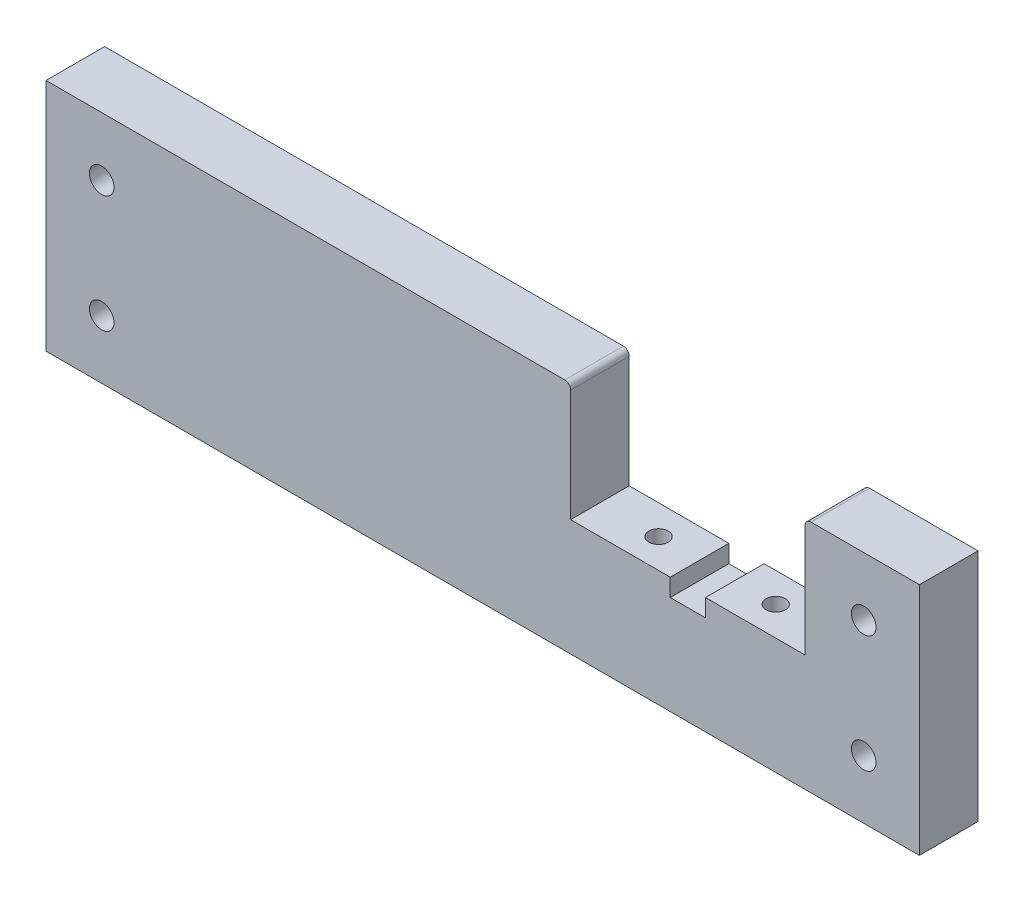
ISO-10303-21;
HEADER;
FILE_DESCRIPTION(('STEP AP214'),'2;1');
FILE_NAME('part.step','',(''),(''),'','','');
FILE_SCHEMA(('AUTOMOTIVE_DESIGN { 1 0 10303 214 1 1 1 1 }'));
ENDSEC;
DATA;
#1=APPLICATION_CONTEXT('core data for automotive mechanical design processes');
#2=APPLICATION_PROTOCOL_DEFINITION('international standard','automotive_design',2000,#1);
#3=PRODUCT_CONTEXT('',#1,'mechanical');
#4=PRODUCT('Part','Part','',(#3));
#5=PRODUCT_RELATED_PRODUCT_CATEGORY('part','',(#4));
#6=PRODUCT_DEFINITION_FORMATION('','',#4);
#7=PRODUCT_DEFINITION_CONTEXT('part definition',#1,'design');
#8=PRODUCT_DEFINITION('design','',#6,#7);
#9=PRODUCT_DEFINITION_SHAPE('','',#8);
#10=(LENGTH_UNIT() NAMED_UNIT(*) SI_UNIT(.MILLI.,.METRE.));
#11=(NAMED_UNIT(*) PLANE_ANGLE_UNIT() SI_UNIT($,.RADIAN.));
#12=(NAMED_UNIT(*) SI_UNIT($,.STERADIAN.) SOLID_ANGLE_UNIT());
#13=UNCERTAINTY_MEASURE_WITH_UNIT(LENGTH_MEASURE(1.E-05),#10,'distance_accuracy_value','');
#14=(GEOMETRIC_REPRESENTATION_CONTEXT(3) GLOBAL_UNCERTAINTY_ASSIGNED_CONTEXT((#13)) GLOBAL_UNIT_ASSIGNED_CONTEXT((#10,
#11,#12)) REPRESENTATION_CONTEXT('',''));
#15=CARTESIAN_POINT('',(0.,0.,0.));
#16=DIRECTION('',(0.,0.,1.));
#17=DIRECTION('',(1.,0.,0.));
#18=AXIS2_PLACEMENT_3D('',#15,#16,#17);
#19=CARTESIAN_POINT('',(55.,0.,-10.));
#20=DIRECTION('',(1.,0.,0.));
#21=DIRECTION('',(0.,0.,-1.));
#22=AXIS2_PLACEMENT_3D('',#19,#20,#21);
#23=PLANE('',#22);
#24=DIRECTION('',(0.,1.,0.));
#25=VECTOR('',#24,1.);
#26=CARTESIAN_POINT('',(55.,0.,0.));
#27=LINE('',#26,#25);
#28=CARTESIAN_POINT('',(55.,19.855,0.));
#29=VERTEX_POINT('',#28);
#30=CARTESIAN_POINT('',(55.,39.,0.));
#31=VERTEX_POINT('',#30);
#32=EDGE_CURVE('E239',#29,#31,#27,.T.);
#33=ORIENTED_EDGE('',*,*,#32,.T.);
#34=DIRECTION('',(0.,0.,1.));
#35=VECTOR('',#34,1.);
#36=CARTESIAN_POINT('',(55.,39.,-10.));
#37=LINE('',#36,#35);
#38=CARTESIAN_POINT('',(55.,39.,-10.));
#39=VERTEX_POINT('',#38);
#40=EDGE_CURVE('E363',#31,#39,#37,.F.);
#41=ORIENTED_EDGE('',*,*,#40,.T.);
#42=DIRECTION('',(0.,1.,0.));
#43=VECTOR('',#42,1.);
#44=CARTESIAN_POINT('',(55.,0.,-10.));
#45=LINE('',#44,#43);
#46=CARTESIAN_POINT('',(55.,19.855,-10.));
#47=VERTEX_POINT('',#46);
#48=EDGE_CURVE('E240',#47,#39,#45,.T.);
#49=ORIENTED_EDGE('',*,*,#48,.F.);
#50=DIRECTION('',(0.,0.,1.));
#51=VECTOR('',#50,1.);
#52=CARTESIAN_POINT('',(55.,19.855,-10.));
#53=LINE('',#52,#51);
#54=EDGE_CURVE('E350',#47,#29,#53,.T.);
#55=ORIENTED_EDGE('',*,*,#54,.T.);
#56=EDGE_LOOP('',(#33,#41,#49,#55));
#57=FACE_BOUND('',#56,.T.);
#58=ADVANCED_FACE('F42',(#57),#23,.F.);
#59=CARTESIAN_POINT('',(0.,40.,-10.));
#60=DIRECTION('',(0.,-1.,0.));
#61=DIRECTION('',(0.,0.,-1.));
#62=AXIS2_PLACEMENT_3D('',#59,#60,#61);
#63=PLANE('',#62);
#64=DIRECTION('',(1.,0.,0.));
#65=VECTOR('',#64,1.);
#66=CARTESIAN_POINT('',(0.,40.,-10.));
#67=LINE('',#66,#65);
#68=CARTESIAN_POINT('',(56.,40.,-10.));
#69=VERTEX_POINT('',#68);
#70=CARTESIAN_POINT('',(74.5,40.,-10.));
#71=VERTEX_POINT('',#70);
#72=EDGE_CURVE('E269',#69,#71,#67,.T.);
#73=ORIENTED_EDGE('',*,*,#72,.F.);
#74=DIRECTION('',(0.,0.,1.));
#75=VECTOR('',#74,1.);
#76=CARTESIAN_POINT('',(56.,40.,-10.));
#77=LINE('',#76,#75);
#78=CARTESIAN_POINT('',(56.,40.,0.));
#79=VERTEX_POINT('',#78);
#80=EDGE_CURVE('E324',#69,#79,#77,.T.);
#81=ORIENTED_EDGE('',*,*,#80,.T.);
#82=DIRECTION('',(1.,0.,0.));
#83=VECTOR('',#82,1.);
#84=CARTESIAN_POINT('',(0.,40.,0.));
#85=LINE('',#84,#83);
#86=CARTESIAN_POINT('',(74.5,40.,0.));
#87=VERTEX_POINT('',#86);
#88=EDGE_CURVE('E245',#79,#87,#85,.T.);
#89=ORIENTED_EDGE('',*,*,#88,.T.);
#90=DIRECTION('',(0.,0.,1.));
#91=VECTOR('',#90,1.);
#92=CARTESIAN_POINT('',(74.5,40.,-10.));
#93=LINE('',#92,#91);
#94=EDGE_CURVE('E320',#71,#87,#93,.T.);
#95=ORIENTED_EDGE('',*,*,#94,.F.);
#96=EDGE_LOOP('',(#73,#81,#89,#95));
#97=FACE_BOUND('',#96,.T.);
#98=ADVANCED_FACE('F416',(#97),#63,.F.);
#99=CARTESIAN_POINT('',(74.5,0.,-10.));
#100=DIRECTION('',(-1.,0.,0.));
#101=DIRECTION('',(0.,0.,1.));
#102=AXIS2_PLACEMENT_3D('',#99,#100,#101);
#103=PLANE('',#102);
#104=DIRECTION('',(0.,-1.,0.));
#105=VECTOR('',#104,1.);
#106=CARTESIAN_POINT('',(74.5,0.,0.));
#107=LINE('',#106,#105);
#108=CARTESIAN_POINT('',(74.5,0.,0.));
#109=VERTEX_POINT('',#108);
#110=EDGE_CURVE('E316',#87,#109,#107,.T.);
#111=ORIENTED_EDGE('',*,*,#110,.T.);
#112=DIRECTION('',(0.,0.,1.));
#113=VECTOR('',#112,1.);
#114=CARTESIAN_POINT('',(74.5,0.,-10.));
#115=LINE('',#114,#113);
#116=CARTESIAN_POINT('',(74.5,0.,-10.));
#117=VERTEX_POINT('',#116);
#118=EDGE_CURVE('E325',#117,#109,#115,.T.);
#119=ORIENTED_EDGE('',*,*,#118,.F.);
#120=DIRECTION('',(0.,-1.,0.));
#121=VECTOR('',#120,1.);
#122=CARTESIAN_POINT('',(74.5,0.,-10.));
#123=LINE('',#122,#121);
#124=EDGE_CURVE('E277',#71,#117,#123,.T.);
#125=ORIENTED_EDGE('',*,*,#124,.F.);
#126=ORIENTED_EDGE('',*,*,#94,.T.);
#127=EDGE_LOOP('',(#111,#119,#125,#126));
#128=FACE_BOUND('',#127,.T.);
#129=ADVANCED_FACE('F422',(#128),#103,.F.);
#130=CARTESIAN_POINT('',(0.,0.,-10.));
#131=DIRECTION('',(0.,-1.,0.));
#132=DIRECTION('',(1.,0.,0.));
#133=AXIS2_PLACEMENT_3D('',#130,#131,#132);
#134=PLANE('',#133);
#135=CARTESIAN_POINT('',(-60.,0.,-5.));
#136=DIRECTION('',(0.,-1.,0.));
#137=DIRECTION('',(0.,0.,-1.));
#138=AXIS2_PLACEMENT_3D('',#135,#136,#137);
#139=CIRCLE('',#138,2.09999999999999);
#140=CARTESIAN_POINT('',(-60.,0.,-7.09999999999999));
#141=VERTEX_POINT('',#140);
#142=EDGE_CURVE('E170',#141,#141,#139,.T.);
#143=ORIENTED_EDGE('',*,*,#142,.F.);
#144=EDGE_LOOP('',(#143));
#145=FACE_BOUND('',#144,.T.);
#146=CARTESIAN_POINT('',(0.,0.,-5.));
#147=DIRECTION('',(0.,-1.,0.));
#148=DIRECTION('',(0.,0.,-1.));
#149=AXIS2_PLACEMENT_3D('',#146,#147,#148);
#150=CIRCLE('',#149,2.09999999999999);
#151=CARTESIAN_POINT('',(0.,0.,-7.09999999999999));
#152=VERTEX_POINT('',#151);
#153=EDGE_CURVE('E169',#152,#152,#150,.T.);
#154=ORIENTED_EDGE('',*,*,#153,.F.);
#155=EDGE_LOOP('',(#154));
#156=FACE_BOUND('',#155,.T.);
#157=CARTESIAN_POINT('',(60.,0.,-5.));
#158=DIRECTION('',(0.,-1.,0.));
#159=DIRECTION('',(0.,0.,-1.));
#160=AXIS2_PLACEMENT_3D('',#157,#158,#159);
#161=CIRCLE('',#160,2.09999999999999);
#162=CARTESIAN_POINT('',(60.,0.,-7.09999999999999));
#163=VERTEX_POINT('',#162);
#164=EDGE_CURVE('E183',#163,#163,#161,.T.);
#165=ORIENTED_EDGE('',*,*,#164,.F.);
#166=EDGE_LOOP('',(#165));
#167=FACE_BOUND('',#166,.T.);
#168=DIRECTION('',(1.,0.,0.));
#169=VECTOR('',#168,1.);
#170=CARTESIAN_POINT('',(0.,0.,0.));
#171=LINE('',#170,#169);
#172=CARTESIAN_POINT('',(-74.5,0.,0.));
#173=VERTEX_POINT('',#172);
#174=EDGE_CURVE('E312',#173,#109,#171,.T.);
#175=ORIENTED_EDGE('',*,*,#174,.F.);
#176=DIRECTION('',(0.,0.,1.));
#177=VECTOR('',#176,1.);
#178=CARTESIAN_POINT('',(-74.5,0.,-10.));
#179=LINE('',#178,#177);
#180=CARTESIAN_POINT('',(-74.5,0.,-10.));
#181=VERTEX_POINT('',#180);
#182=EDGE_CURVE('E328',#181,#173,#179,.T.);
#183=ORIENTED_EDGE('',*,*,#182,.F.);
#184=DIRECTION('',(1.,0.,0.));
#185=VECTOR('',#184,1.);
#186=CARTESIAN_POINT('',(0.,0.,-10.));
#187=LINE('',#186,#185);
#188=EDGE_CURVE('E273',#181,#117,#187,.T.);
#189=ORIENTED_EDGE('',*,*,#188,.T.);
#190=ORIENTED_EDGE('',*,*,#118,.T.);
#191=EDGE_LOOP('',(#175,#183,#189,#190));
#192=FACE_BOUND('',#191,.T.);
#193=ADVANCED_FACE('F427',(#145,#156,#167,#192),#134,.T.);
#194=CARTESIAN_POINT('',(-74.5,0.,-10.));
#195=DIRECTION('',(-1.,0.,0.));
#196=DIRECTION('',(0.,0.,1.));
#197=AXIS2_PLACEMENT_3D('',#194,#195,#196);
#198=PLANE('',#197);
#199=DIRECTION('',(0.,-1.,0.));
#200=VECTOR('',#199,1.);
#201=CARTESIAN_POINT('',(-74.5,0.,0.));
#202=LINE('',#201,#200);
#203=CARTESIAN_POINT('',(-74.5,40.,0.));
#204=VERTEX_POINT('',#203);
#205=EDGE_CURVE('E308',#204,#173,#202,.T.);
#206=ORIENTED_EDGE('',*,*,#205,.F.);
#207=DIRECTION('',(0.,0.,1.));
#208=VECTOR('',#207,1.);
#209=CARTESIAN_POINT('',(-74.5,40.,-10.));
#210=LINE('',#209,#208);
#211=CARTESIAN_POINT('',(-74.5,40.,-10.));
#212=VERTEX_POINT('',#211);
#213=EDGE_CURVE('E331',#212,#204,#210,.T.);
#214=ORIENTED_EDGE('',*,*,#213,.F.);
#215=DIRECTION('',(0.,-1.,0.));
#216=VECTOR('',#215,1.);
#217=CARTESIAN_POINT('',(-74.5,0.,-10.));
#218=LINE('',#217,#216);
#219=EDGE_CURVE('E268',#212,#181,#218,.T.);
#220=ORIENTED_EDGE('',*,*,#219,.T.);
#221=ORIENTED_EDGE('',*,*,#182,.T.);
#222=EDGE_LOOP('',(#206,#214,#220,#221));
#223=FACE_BOUND('',#222,.T.);
#224=ADVANCED_FACE('F431',(#223),#198,.T.);
#225=CARTESIAN_POINT('',(14.,40.,0.));
#226=VERTEX_POINT('',#225);
#227=EDGE_CURVE('E305',#204,#226,#85,.T.);
#228=ORIENTED_EDGE('',*,*,#227,.T.);
#229=DIRECTION('',(0.,0.,1.));
#230=VECTOR('',#229,1.);
#231=CARTESIAN_POINT('',(14.,40.,-10.));
#232=LINE('',#231,#230);
#233=CARTESIAN_POINT('',(14.,40.,-10.));
#234=VERTEX_POINT('',#233);
#235=EDGE_CURVE('E11',#226,#234,#232,.F.);
#236=ORIENTED_EDGE('',*,*,#235,.T.);
#237=EDGE_CURVE('E265',#212,#234,#67,.T.);
#238=ORIENTED_EDGE('',*,*,#237,.F.);
#239=ORIENTED_EDGE('',*,*,#213,.T.);
#240=EDGE_LOOP('',(#228,#236,#238,#239));
#241=FACE_BOUND('',#240,.T.);
#242=ADVANCED_FACE('F432',(#241),#63,.F.);
#243=CARTESIAN_POINT('',(15.,0.,-10.));
#244=DIRECTION('',(1.,0.,0.));
#245=DIRECTION('',(0.,1.,0.));
#246=AXIS2_PLACEMENT_3D('',#243,#244,#245);
#247=PLANE('',#246);
#248=DIRECTION('',(0.,1.,0.));
#249=VECTOR('',#248,1.);
#250=CARTESIAN_POINT('',(15.,0.,-10.));
#251=LINE('',#250,#249);
#252=CARTESIAN_POINT('',(15.,19.855,-10.));
#253=VERTEX_POINT('',#252);
#254=CARTESIAN_POINT('',(15.,39.,-10.));
#255=VERTEX_POINT('',#254);
#256=EDGE_CURVE('E262',#253,#255,#251,.T.);
#257=ORIENTED_EDGE('',*,*,#256,.T.);
#258=DIRECTION('',(0.,0.,1.));
#259=VECTOR('',#258,1.);
#260=CARTESIAN_POINT('',(15.,39.,0.));
#261=LINE('',#260,#259);
#262=CARTESIAN_POINT('',(15.,39.,0.));
#263=VERTEX_POINT('',#262);
#264=EDGE_CURVE('E51',#255,#263,#261,.T.);
#265=ORIENTED_EDGE('',*,*,#264,.T.);
#266=DIRECTION('',(0.,1.,0.));
#267=VECTOR('',#266,1.);
#268=CARTESIAN_POINT('',(15.,0.,0.));
#269=LINE('',#268,#267);
#270=CARTESIAN_POINT('',(15.,19.855,0.));
#271=VERTEX_POINT('',#270);
#272=EDGE_CURVE('E301',#271,#263,#269,.T.);
#273=ORIENTED_EDGE('',*,*,#272,.F.);
#274=DIRECTION('',(0.,0.,1.));
#275=VECTOR('',#274,1.);
#276=CARTESIAN_POINT('',(15.,19.855,-10.));
#277=LINE('',#276,#275);
#278=EDGE_CURVE('E334',#253,#271,#277,.T.);
#279=ORIENTED_EDGE('',*,*,#278,.F.);
#280=EDGE_LOOP('',(#257,#265,#273,#279));
#281=FACE_BOUND('',#280,.T.);
#282=ADVANCED_FACE('F375',(#281),#247,.T.);
#283=CARTESIAN_POINT('',(0.,19.855,-10.));
#284=DIRECTION('',(0.,1.,0.));
#285=DIRECTION('',(-1.,0.,0.));
#286=AXIS2_PLACEMENT_3D('',#283,#284,#285);
#287=PLANE('',#286);
#288=CARTESIAN_POINT('',(25.,19.855,-5.));
#289=DIRECTION('',(0.,1.,0.));
#290=DIRECTION('',(0.,0.,1.));
#291=AXIS2_PLACEMENT_3D('',#288,#289,#290);
#292=CIRCLE('',#291,1.64999999999999);
#293=CARTESIAN_POINT('',(25.,19.855,-3.35000000000001));
#294=VERTEX_POINT('',#293);
#295=EDGE_CURVE('E223',#294,#294,#292,.T.);
#296=ORIENTED_EDGE('',*,*,#295,.F.);
#297=EDGE_LOOP('',(#296));
#298=FACE_BOUND('',#297,.T.);
#299=DIRECTION('',(-1.,0.,0.));
#300=VECTOR('',#299,1.);
#301=CARTESIAN_POINT('',(0.,19.855,0.));
#302=LINE('',#301,#300);
#303=CARTESIAN_POINT('',(31.995,19.855,0.));
#304=VERTEX_POINT('',#303);
#305=EDGE_CURVE('E297',#304,#271,#302,.T.);
#306=ORIENTED_EDGE('',*,*,#305,.F.);
#307=DIRECTION('',(0.,0.,1.));
#308=VECTOR('',#307,1.);
#309=CARTESIAN_POINT('',(31.995,19.855,-10.));
#310=LINE('',#309,#308);
#311=CARTESIAN_POINT('',(31.995,19.855,-10.));
#312=VERTEX_POINT('',#311);
#313=EDGE_CURVE('E337',#312,#304,#310,.T.);
#314=ORIENTED_EDGE('',*,*,#313,.F.);
#315=DIRECTION('',(-1.,0.,0.));
#316=VECTOR('',#315,1.);
#317=CARTESIAN_POINT('',(0.,19.855,-10.));
#318=LINE('',#317,#316);
#319=EDGE_CURVE('E258',#312,#253,#318,.T.);
#320=ORIENTED_EDGE('',*,*,#319,.T.);
#321=ORIENTED_EDGE('',*,*,#278,.T.);
#322=EDGE_LOOP('',(#306,#314,#320,#321));
#323=FACE_BOUND('',#322,.T.);
#324=ADVANCED_FACE('F385',(#298,#323),#287,.T.);
#325=CARTESIAN_POINT('',(31.995,0.,-10.));
#326=DIRECTION('',(-1.,0.,0.));
#327=DIRECTION('',(0.,0.,1.));
#328=AXIS2_PLACEMENT_3D('',#325,#326,#327);
#329=PLANE('',#328);
#330=DIRECTION('',(0.,-1.,0.));
#331=VECTOR('',#330,1.);
#332=CARTESIAN_POINT('',(31.995,0.,0.));
#333=LINE('',#332,#331);
#334=CARTESIAN_POINT('',(31.995,16.85,0.));
#335=VERTEX_POINT('',#334);
#336=EDGE_CURVE('E294',#304,#335,#333,.T.);
#337=ORIENTED_EDGE('',*,*,#336,.T.);
#338=DIRECTION('',(0.,0.,1.));
#339=VECTOR('',#338,1.);
#340=CARTESIAN_POINT('',(31.995,16.85,-10.));
#341=LINE('',#340,#339);
#342=CARTESIAN_POINT('',(31.995,16.85,-10.));
#343=VERTEX_POINT('',#342);
#344=EDGE_CURVE('E340',#343,#335,#341,.T.);
#345=ORIENTED_EDGE('',*,*,#344,.F.);
#346=DIRECTION('',(0.,-1.,0.));
#347=VECTOR('',#346,1.);
#348=CARTESIAN_POINT('',(31.995,0.,-10.));
#349=LINE('',#348,#347);
#350=EDGE_CURVE('E255',#312,#343,#349,.T.);
#351=ORIENTED_EDGE('',*,*,#350,.F.);
#352=ORIENTED_EDGE('',*,*,#313,.T.);
#353=EDGE_LOOP('',(#337,#345,#351,#352));
#354=FACE_BOUND('',#353,.T.);
#355=ADVANCED_FACE('F394',(#354),#329,.F.);
#356=CARTESIAN_POINT('',(0.,16.85,-10.));
#357=DIRECTION('',(0.,-1.,0.));
#358=DIRECTION('',(0.,0.,-1.));
#359=AXIS2_PLACEMENT_3D('',#356,#357,#358);
#360=PLANE('',#359);
#361=DIRECTION('',(1.,0.,0.));
#362=VECTOR('',#361,1.);
#363=CARTESIAN_POINT('',(0.,16.85,0.));
#364=LINE('',#363,#362);
#365=CARTESIAN_POINT('',(38.005,16.85,0.));
#366=VERTEX_POINT('',#365);
#367=EDGE_CURVE('E290',#335,#366,#364,.T.);
#368=ORIENTED_EDGE('',*,*,#367,.T.);
#369=DIRECTION('',(0.,0.,1.));
#370=VECTOR('',#369,1.);
#371=CARTESIAN_POINT('',(38.005,16.85,-10.));
#372=LINE('',#371,#370);
#373=CARTESIAN_POINT('',(38.005,16.85,-10.));
#374=VERTEX_POINT('',#373);
#375=EDGE_CURVE('E344',#374,#366,#372,.T.);
#376=ORIENTED_EDGE('',*,*,#375,.F.);
#377=DIRECTION('',(1.,0.,0.));
#378=VECTOR('',#377,1.);
#379=CARTESIAN_POINT('',(0.,16.85,-10.));
#380=LINE('',#379,#378);
#381=EDGE_CURVE('E252',#343,#374,#380,.T.);
#382=ORIENTED_EDGE('',*,*,#381,.F.);
#383=ORIENTED_EDGE('',*,*,#344,.T.);
#384=EDGE_LOOP('',(#368,#376,#382,#383));
#385=FACE_BOUND('',#384,.T.);
#386=ADVANCED_FACE('F396',(#385),#360,.F.);
#387=CARTESIAN_POINT('',(38.005,0.,-10.));
#388=DIRECTION('',(-1.,0.,0.));
#389=DIRECTION('',(0.,0.,1.));
#390=AXIS2_PLACEMENT_3D('',#387,#388,#389);
#391=PLANE('',#390);
#392=DIRECTION('',(0.,-1.,0.));
#393=VECTOR('',#392,1.);
#394=CARTESIAN_POINT('',(38.005,0.,0.));
#395=LINE('',#394,#393);
#396=CARTESIAN_POINT('',(38.005,19.855,0.));
#397=VERTEX_POINT('',#396);
#398=EDGE_CURVE('E286',#397,#366,#395,.T.);
#399=ORIENTED_EDGE('',*,*,#398,.F.);
#400=DIRECTION('',(0.,0.,1.));
#401=VECTOR('',#400,1.);
#402=CARTESIAN_POINT('',(38.005,19.855,-10.));
#403=LINE('',#402,#401);
#404=CARTESIAN_POINT('',(38.005,19.855,-10.));
#405=VERTEX_POINT('',#404);
#406=EDGE_CURVE('E347',#405,#397,#403,.T.);
#407=ORIENTED_EDGE('',*,*,#406,.F.);
#408=DIRECTION('',(0.,-1.,0.));
#409=VECTOR('',#408,1.);
#410=CARTESIAN_POINT('',(38.005,0.,-10.));
#411=LINE('',#410,#409);
#412=EDGE_CURVE('E248',#405,#374,#411,.T.);
#413=ORIENTED_EDGE('',*,*,#412,.T.);
#414=ORIENTED_EDGE('',*,*,#375,.T.);
#415=EDGE_LOOP('',(#399,#407,#413,#414));
#416=FACE_BOUND('',#415,.T.);
#417=ADVANCED_FACE('F399',(#416),#391,.T.);
#418=CARTESIAN_POINT('',(0.,19.855,-10.));
#419=DIRECTION('',(0.,-1.,0.));
#420=DIRECTION('',(1.,0.,0.));
#421=AXIS2_PLACEMENT_3D('',#418,#419,#420);
#422=PLANE('',#421);
#423=CARTESIAN_POINT('',(45.,19.855,-5.));
#424=DIRECTION('',(0.,1.,0.));
#425=DIRECTION('',(0.,0.,1.));
#426=AXIS2_PLACEMENT_3D('',#423,#424,#425);
#427=CIRCLE('',#426,1.64999999999999);
#428=CARTESIAN_POINT('',(45.,19.855,-3.35000000000001));
#429=VERTEX_POINT('',#428);
#430=EDGE_CURVE('E231',#429,#429,#427,.T.);
#431=ORIENTED_EDGE('',*,*,#430,.F.);
#432=EDGE_LOOP('',(#431));
#433=FACE_BOUND('',#432,.T.);
#434=DIRECTION('',(1.,0.,0.));
#435=VECTOR('',#434,1.);
#436=CARTESIAN_POINT('',(0.,19.855,0.));
#437=LINE('',#436,#435);
#438=EDGE_CURVE('E283',#397,#29,#437,.T.);
#439=ORIENTED_EDGE('',*,*,#438,.T.);
#440=ORIENTED_EDGE('',*,*,#54,.F.);
#441=DIRECTION('',(1.,0.,0.));
#442=VECTOR('',#441,1.);
#443=CARTESIAN_POINT('',(0.,19.855,-10.));
#444=LINE('',#443,#442);
#445=EDGE_CURVE('E244',#405,#47,#444,.T.);
#446=ORIENTED_EDGE('',*,*,#445,.F.);
#447=ORIENTED_EDGE('',*,*,#406,.T.);
#448=EDGE_LOOP('',(#439,#440,#446,#447));
#449=FACE_BOUND('',#448,.T.);
#450=ADVANCED_FACE('F405',(#433,#449),#422,.F.);
#451=CARTESIAN_POINT('',(0.,0.,-10.));
#452=DIRECTION('',(0.,0.,1.));
#453=DIRECTION('',(1.,0.,0.));
#454=AXIS2_PLACEMENT_3D('',#451,#452,#453);
#455=PLANE('',#454);
#456=CARTESIAN_POINT('',(-65.,30.,-10.));
#457=DIRECTION('',(0.,0.,1.));
#458=DIRECTION('',(1.,0.,0.));
#459=AXIS2_PLACEMENT_3D('',#456,#457,#458);
#460=CIRCLE('',#459,2.09999999999999);
#461=CARTESIAN_POINT('',(-62.9,30.,-10.));
#462=VERTEX_POINT('',#461);
#463=EDGE_CURVE('E195',#462,#462,#460,.T.);
#464=ORIENTED_EDGE('',*,*,#463,.T.);
#465=EDGE_LOOP('',(#464));
#466=FACE_BOUND('',#465,.T.);
#467=CARTESIAN_POINT('',(-65.,10.,-10.));
#468=DIRECTION('',(0.,0.,1.));
#469=DIRECTION('',(1.,0.,0.));
#470=AXIS2_PLACEMENT_3D('',#467,#468,#469);
#471=CIRCLE('',#470,2.09999999999999);
#472=CARTESIAN_POINT('',(-62.9,10.,-10.));
#473=VERTEX_POINT('',#472);
#474=EDGE_CURVE('E203',#473,#473,#471,.T.);
#475=ORIENTED_EDGE('',*,*,#474,.T.);
#476=EDGE_LOOP('',(#475));
#477=FACE_BOUND('',#476,.T.);
#478=CARTESIAN_POINT('',(65.,10.,-10.));
#479=DIRECTION('',(0.,0.,1.));
#480=DIRECTION('',(1.,0.,0.));
#481=AXIS2_PLACEMENT_3D('',#478,#479,#480);
#482=CIRCLE('',#481,2.09999999999999);
#483=CARTESIAN_POINT('',(67.1,10.,-10.));
#484=VERTEX_POINT('',#483);
#485=EDGE_CURVE('E211',#484,#484,#482,.T.);
#486=ORIENTED_EDGE('',*,*,#485,.T.);
#487=EDGE_LOOP('',(#486));
#488=FACE_BOUND('',#487,.T.);
#489=CARTESIAN_POINT('',(65.,30.,-10.));
#490=DIRECTION('',(0.,0.,1.));
#491=DIRECTION('',(1.,0.,0.));
#492=AXIS2_PLACEMENT_3D('',#489,#490,#491);
#493=CIRCLE('',#492,2.09999999999999);
#494=CARTESIAN_POINT('',(67.1,30.,-10.));
#495=VERTEX_POINT('',#494);
#496=EDGE_CURVE('E219',#495,#495,#493,.T.);
#497=ORIENTED_EDGE('',*,*,#496,.T.);
#498=EDGE_LOOP('',(#497));
#499=FACE_BOUND('',#498,.T.);
#500=ORIENTED_EDGE('',*,*,#48,.T.);
#501=CARTESIAN_POINT('',(56.,39.,-10.));
#502=DIRECTION('',(0.,0.,1.));
#503=DIRECTION('',(1.,0.,0.));
#504=AXIS2_PLACEMENT_3D('',#501,#502,#503);
#505=CIRCLE('',#504,1.);
#506=EDGE_CURVE('E368',#39,#69,#505,.F.);
#507=ORIENTED_EDGE('',*,*,#506,.T.);
#508=ORIENTED_EDGE('',*,*,#72,.T.);
#509=ORIENTED_EDGE('',*,*,#124,.T.);
#510=ORIENTED_EDGE('',*,*,#188,.F.);
#511=ORIENTED_EDGE('',*,*,#219,.F.);
#512=ORIENTED_EDGE('',*,*,#237,.T.);
#513=CARTESIAN_POINT('',(14.,39.,-10.));
#514=DIRECTION('',(0.,0.,1.));
#515=DIRECTION('',(1.,0.,0.));
#516=AXIS2_PLACEMENT_3D('',#513,#514,#515);
#517=CIRCLE('',#516,1.);
#518=EDGE_CURVE('E58',#234,#255,#517,.F.);
#519=ORIENTED_EDGE('',*,*,#518,.T.);
#520=ORIENTED_EDGE('',*,*,#256,.F.);
#521=ORIENTED_EDGE('',*,*,#319,.F.);
#522=ORIENTED_EDGE('',*,*,#350,.T.);
#523=ORIENTED_EDGE('',*,*,#381,.T.);
#524=ORIENTED_EDGE('',*,*,#412,.F.);
#525=ORIENTED_EDGE('',*,*,#445,.T.);
#526=EDGE_LOOP('',(#500,#507,#508,#509,#510,#511,#512,#519,#520,#521,#522,#523,#524,#525));
#527=FACE_BOUND('',#526,.T.);
#528=ADVANCED_FACE('F388',(#466,#477,#488,#499,#527),#455,.F.);
#529=CARTESIAN_POINT('',(0.,0.,0.));
#530=DIRECTION('',(0.,0.,1.));
#531=DIRECTION('',(1.,0.,0.));
#532=AXIS2_PLACEMENT_3D('',#529,#530,#531);
#533=PLANE('',#532);
#534=CARTESIAN_POINT('',(-65.,30.,0.));
#535=DIRECTION('',(0.,0.,1.));
#536=DIRECTION('',(1.,0.,0.));
#537=AXIS2_PLACEMENT_3D('',#534,#535,#536);
#538=CIRCLE('',#537,2.09999999999999);
#539=CARTESIAN_POINT('',(-62.9,30.,0.));
#540=VERTEX_POINT('',#539);
#541=EDGE_CURVE('E191',#540,#540,#538,.T.);
#542=ORIENTED_EDGE('',*,*,#541,.F.);
#543=EDGE_LOOP('',(#542));
#544=FACE_BOUND('',#543,.T.);
#545=CARTESIAN_POINT('',(-65.,10.,0.));
#546=DIRECTION('',(0.,0.,1.));
#547=DIRECTION('',(1.,0.,0.));
#548=AXIS2_PLACEMENT_3D('',#545,#546,#547);
#549=CIRCLE('',#548,2.09999999999999);
#550=CARTESIAN_POINT('',(-62.9,10.,0.));
#551=VERTEX_POINT('',#550);
#552=EDGE_CURVE('E199',#551,#551,#549,.T.);
#553=ORIENTED_EDGE('',*,*,#552,.F.);
#554=EDGE_LOOP('',(#553));
#555=FACE_BOUND('',#554,.T.);
#556=CARTESIAN_POINT('',(65.,10.,0.));
#557=DIRECTION('',(0.,0.,1.));
#558=DIRECTION('',(1.,0.,0.));
#559=AXIS2_PLACEMENT_3D('',#556,#557,#558);
#560=CIRCLE('',#559,2.09999999999999);
#561=CARTESIAN_POINT('',(67.1,10.,0.));
#562=VERTEX_POINT('',#561);
#563=EDGE_CURVE('E207',#562,#562,#560,.T.);
#564=ORIENTED_EDGE('',*,*,#563,.F.);
#565=EDGE_LOOP('',(#564));
#566=FACE_BOUND('',#565,.T.);
#567=CARTESIAN_POINT('',(65.,30.,0.));
#568=DIRECTION('',(0.,0.,1.));
#569=DIRECTION('',(1.,0.,0.));
#570=AXIS2_PLACEMENT_3D('',#567,#568,#569);
#571=CIRCLE('',#570,2.09999999999999);
#572=CARTESIAN_POINT('',(67.1,30.,0.));
#573=VERTEX_POINT('',#572);
#574=EDGE_CURVE('E215',#573,#573,#571,.T.);
#575=ORIENTED_EDGE('',*,*,#574,.F.);
#576=EDGE_LOOP('',(#575));
#577=FACE_BOUND('',#576,.T.);
#578=ORIENTED_EDGE('',*,*,#88,.F.);
#579=CARTESIAN_POINT('',(56.,39.,0.));
#580=DIRECTION('',(0.,0.,1.));
#581=DIRECTION('',(1.,0.,0.));
#582=AXIS2_PLACEMENT_3D('',#579,#580,#581);
#583=CIRCLE('',#582,1.);
#584=EDGE_CURVE('E360',#79,#31,#583,.T.);
#585=ORIENTED_EDGE('',*,*,#584,.T.);
#586=ORIENTED_EDGE('',*,*,#32,.F.);
#587=ORIENTED_EDGE('',*,*,#438,.F.);
#588=ORIENTED_EDGE('',*,*,#398,.T.);
#589=ORIENTED_EDGE('',*,*,#367,.F.);
#590=ORIENTED_EDGE('',*,*,#336,.F.);
#591=ORIENTED_EDGE('',*,*,#305,.T.);
#592=ORIENTED_EDGE('',*,*,#272,.T.);
#593=CARTESIAN_POINT('',(14.,39.,0.));
#594=DIRECTION('',(0.,0.,1.));
#595=DIRECTION('',(1.,0.,0.));
#596=AXIS2_PLACEMENT_3D('',#593,#594,#595);
#597=CIRCLE('',#596,1.);
#598=EDGE_CURVE('E357',#263,#226,#597,.T.);
#599=ORIENTED_EDGE('',*,*,#598,.T.);
#600=ORIENTED_EDGE('',*,*,#227,.F.);
#601=ORIENTED_EDGE('',*,*,#205,.T.);
#602=ORIENTED_EDGE('',*,*,#174,.T.);
#603=ORIENTED_EDGE('',*,*,#110,.F.);
#604=EDGE_LOOP('',(#578,#585,#586,#587,#588,#589,#590,#591,#592,#599,#600,#601,#602,#603));
#605=FACE_BOUND('',#604,.T.);
#606=ADVANCED_FACE('F379',(#544,#555,#566,#577,#605),#533,.T.);
#607=CARTESIAN_POINT('',(45.,14.855,-5.));
#608=DIRECTION('',(0.,1.,0.));
#609=DIRECTION('',(0.,0.,1.));
#610=AXIS2_PLACEMENT_3D('',#607,#608,#609);
#611=CONICAL_SURFACE('',#610,1.65,1.02974425867666);
#612=CARTESIAN_POINT('',(45.,13.8635799786045,-5.));
#613=VERTEX_POINT('',#612);
#614=VERTEX_LOOP('',#613);
#615=FACE_BOUND('',#614,.T.);
#616=CARTESIAN_POINT('',(45.,14.855,-5.));
#617=DIRECTION('',(0.,1.,0.));
#618=DIRECTION('',(0.,0.,1.));
#619=AXIS2_PLACEMENT_3D('',#616,#617,#618);
#620=CIRCLE('',#619,1.65);
#621=CARTESIAN_POINT('',(45.,14.855,-3.35));
#622=VERTEX_POINT('',#621);
#623=EDGE_CURVE('E235',#622,#622,#620,.T.);
#624=ORIENTED_EDGE('',*,*,#623,.T.);
#625=EDGE_LOOP('',(#624));
#626=FACE_BOUND('',#625,.T.);
#627=ADVANCED_FACE('F467',(#615,#626),#611,.F.);
#628=CARTESIAN_POINT('',(45.,19.855,-5.));
#629=DIRECTION('',(0.,1.,0.));
#630=DIRECTION('',(0.,0.,1.));
#631=AXIS2_PLACEMENT_3D('',#628,#629,#630);
#632=CYLINDRICAL_SURFACE('',#631,1.65);
#633=ORIENTED_EDGE('',*,*,#623,.F.);
#634=EDGE_LOOP('',(#633));
#635=FACE_BOUND('',#634,.T.);
#636=ORIENTED_EDGE('',*,*,#430,.T.);
#637=EDGE_LOOP('',(#636));
#638=FACE_BOUND('',#637,.T.);
#639=ADVANCED_FACE('F474',(#635,#638),#632,.F.);
#640=CARTESIAN_POINT('',(25.,14.855,-5.));
#641=DIRECTION('',(0.,1.,0.));
#642=DIRECTION('',(0.,0.,1.));
#643=AXIS2_PLACEMENT_3D('',#640,#641,#642);
#644=CONICAL_SURFACE('',#643,1.65,1.02974425867665);
#645=CARTESIAN_POINT('',(25.,13.8635799786045,-5.));
#646=VERTEX_POINT('',#645);
#647=VERTEX_LOOP('',#646);
#648=FACE_BOUND('',#647,.T.);
#649=CARTESIAN_POINT('',(25.,14.855,-5.));
#650=DIRECTION('',(0.,1.,0.));
#651=DIRECTION('',(0.,0.,1.));
#652=AXIS2_PLACEMENT_3D('',#649,#650,#651);
#653=CIRCLE('',#652,1.65);
#654=CARTESIAN_POINT('',(25.,14.855,-3.35));
#655=VERTEX_POINT('',#654);
#656=EDGE_CURVE('E227',#655,#655,#653,.T.);
#657=ORIENTED_EDGE('',*,*,#656,.T.);
#658=EDGE_LOOP('',(#657));
#659=FACE_BOUND('',#658,.T.);
#660=ADVANCED_FACE('F478',(#648,#659),#644,.F.);
#661=CARTESIAN_POINT('',(25.,19.855,-5.));
#662=DIRECTION('',(0.,1.,0.));
#663=DIRECTION('',(0.,0.,1.));
#664=AXIS2_PLACEMENT_3D('',#661,#662,#663);
#665=CYLINDRICAL_SURFACE('',#664,1.64999999999999);
#666=ORIENTED_EDGE('',*,*,#656,.F.);
#667=EDGE_LOOP('',(#666));
#668=FACE_BOUND('',#667,.T.);
#669=ORIENTED_EDGE('',*,*,#295,.T.);
#670=EDGE_LOOP('',(#669));
#671=FACE_BOUND('',#670,.T.);
#672=ADVANCED_FACE('F482',(#668,#671),#665,.F.);
#673=CARTESIAN_POINT('',(65.,30.,0.));
#674=DIRECTION('',(0.,0.,1.));
#675=DIRECTION('',(1.,0.,0.));
#676=AXIS2_PLACEMENT_3D('',#673,#674,#675);
#677=CYLINDRICAL_SURFACE('',#676,2.09999999999999);
#678=ORIENTED_EDGE('',*,*,#496,.F.);
#679=EDGE_LOOP('',(#678));
#680=FACE_BOUND('',#679,.T.);
#681=ORIENTED_EDGE('',*,*,#574,.T.);
#682=EDGE_LOOP('',(#681));
#683=FACE_BOUND('',#682,.T.);
#684=ADVANCED_FACE('F486',(#680,#683),#677,.F.);
#685=CARTESIAN_POINT('',(65.,10.,0.));
#686=DIRECTION('',(0.,0.,1.));
#687=DIRECTION('',(1.,0.,0.));
#688=AXIS2_PLACEMENT_3D('',#685,#686,#687);
#689=CYLINDRICAL_SURFACE('',#688,2.09999999999999);
#690=ORIENTED_EDGE('',*,*,#485,.F.);
#691=EDGE_LOOP('',(#690));
#692=FACE_BOUND('',#691,.T.);
#693=ORIENTED_EDGE('',*,*,#563,.T.);
#694=EDGE_LOOP('',(#693));
#695=FACE_BOUND('',#694,.T.);
#696=ADVANCED_FACE('F490',(#692,#695),#689,.F.);
#697=CARTESIAN_POINT('',(-65.,10.,0.));
#698=DIRECTION('',(0.,0.,1.));
#699=DIRECTION('',(1.,0.,0.));
#700=AXIS2_PLACEMENT_3D('',#697,#698,#699);
#701=CYLINDRICAL_SURFACE('',#700,2.09999999999999);
#702=ORIENTED_EDGE('',*,*,#474,.F.);
#703=EDGE_LOOP('',(#702));
#704=FACE_BOUND('',#703,.T.);
#705=ORIENTED_EDGE('',*,*,#552,.T.);
#706=EDGE_LOOP('',(#705));
#707=FACE_BOUND('',#706,.T.);
#708=ADVANCED_FACE('F494',(#704,#707),#701,.F.);
#709=CARTESIAN_POINT('',(-65.,30.,0.));
#710=DIRECTION('',(0.,0.,1.));
#711=DIRECTION('',(1.,0.,0.));
#712=AXIS2_PLACEMENT_3D('',#709,#710,#711);
#713=CYLINDRICAL_SURFACE('',#712,2.09999999999999);
#714=ORIENTED_EDGE('',*,*,#463,.F.);
#715=EDGE_LOOP('',(#714));
#716=FACE_BOUND('',#715,.T.);
#717=ORIENTED_EDGE('',*,*,#541,.T.);
#718=EDGE_LOOP('',(#717));
#719=FACE_BOUND('',#718,.T.);
#720=ADVANCED_FACE('F498',(#716,#719),#713,.F.);
#721=CARTESIAN_POINT('',(60.,7.00000000000001,-5.));
#722=DIRECTION('',(0.,-1.,0.));
#723=DIRECTION('',(0.,0.,-1.));
#724=AXIS2_PLACEMENT_3D('',#721,#722,#723);
#725=CONICAL_SURFACE('',#724,2.1,1.02974425867665);
#726=CARTESIAN_POINT('',(60.,8.26180729995789,-5.));
#727=VERTEX_POINT('',#726);
#728=VERTEX_LOOP('',#727);
#729=FACE_BOUND('',#728,.T.);
#730=CARTESIAN_POINT('',(60.,7.00000000000001,-5.));
#731=DIRECTION('',(0.,-1.,0.));
#732=DIRECTION('',(0.,0.,-1.));
#733=AXIS2_PLACEMENT_3D('',#730,#731,#732);
#734=CIRCLE('',#733,2.1);
#735=CARTESIAN_POINT('',(60.,7.00000000000001,-7.1));
#736=VERTEX_POINT('',#735);
#737=EDGE_CURVE('E187',#736,#736,#734,.T.);
#738=ORIENTED_EDGE('',*,*,#737,.T.);
#739=EDGE_LOOP('',(#738));
#740=FACE_BOUND('',#739,.T.);
#741=ADVANCED_FACE('F502',(#729,#740),#725,.F.);
#742=CARTESIAN_POINT('',(60.,0.,-5.));
#743=DIRECTION('',(0.,-1.,0.));
#744=DIRECTION('',(0.,0.,-1.));
#745=AXIS2_PLACEMENT_3D('',#742,#743,#744);
#746=CYLINDRICAL_SURFACE('',#745,2.09999999999999);
#747=ORIENTED_EDGE('',*,*,#737,.F.);
#748=EDGE_LOOP('',(#747));
#749=FACE_BOUND('',#748,.T.);
#750=ORIENTED_EDGE('',*,*,#164,.T.);
#751=EDGE_LOOP('',(#750));
#752=FACE_BOUND('',#751,.T.);
#753=ADVANCED_FACE('F506',(#749,#752),#746,.F.);
#754=CARTESIAN_POINT('',(0.,7.,-5.));
#755=DIRECTION('',(0.,-1.,0.));
#756=DIRECTION('',(0.,0.,-1.));
#757=AXIS2_PLACEMENT_3D('',#754,#755,#756);
#758=CONICAL_SURFACE('',#757,2.1,1.02974425867665);
#759=CARTESIAN_POINT('',(0.,8.26180729995788,-5.));
#760=VERTEX_POINT('',#759);
#761=VERTEX_LOOP('',#760);
#762=FACE_BOUND('',#761,.T.);
#763=CARTESIAN_POINT('',(0.,7.,-5.));
#764=DIRECTION('',(0.,-1.,0.));
#765=DIRECTION('',(0.,0.,-1.));
#766=AXIS2_PLACEMENT_3D('',#763,#764,#765);
#767=CIRCLE('',#766,2.1);
#768=CARTESIAN_POINT('',(0.,7.,-7.1));
#769=VERTEX_POINT('',#768);
#770=EDGE_CURVE('E175',#769,#769,#767,.T.);
#771=ORIENTED_EDGE('',*,*,#770,.T.);
#772=EDGE_LOOP('',(#771));
#773=FACE_BOUND('',#772,.T.);
#774=ADVANCED_FACE('F510',(#762,#773),#758,.F.);
#775=CARTESIAN_POINT('',(0.,0.,-5.));
#776=DIRECTION('',(0.,-1.,0.));
#777=DIRECTION('',(0.,0.,-1.));
#778=AXIS2_PLACEMENT_3D('',#775,#776,#777);
#779=CYLINDRICAL_SURFACE('',#778,2.09999999999999);
#780=ORIENTED_EDGE('',*,*,#770,.F.);
#781=EDGE_LOOP('',(#780));
#782=FACE_BOUND('',#781,.T.);
#783=ORIENTED_EDGE('',*,*,#153,.T.);
#784=EDGE_LOOP('',(#783));
#785=FACE_BOUND('',#784,.T.);
#786=ADVANCED_FACE('F162',(#782,#785),#779,.F.);
#787=CARTESIAN_POINT('',(-60.,6.99999999999999,-5.));
#788=DIRECTION('',(0.,-1.,0.));
#789=DIRECTION('',(0.,0.,-1.));
#790=AXIS2_PLACEMENT_3D('',#787,#788,#789);
#791=CONICAL_SURFACE('',#790,2.1,1.02974425867665);
#792=CARTESIAN_POINT('',(-60.,8.26180729995787,-5.));
#793=VERTEX_POINT('',#792);
#794=VERTEX_LOOP('',#793);
#795=FACE_BOUND('',#794,.T.);
#796=CARTESIAN_POINT('',(-60.,6.99999999999999,-5.));
#797=DIRECTION('',(0.,-1.,0.));
#798=DIRECTION('',(0.,0.,-1.));
#799=AXIS2_PLACEMENT_3D('',#796,#797,#798);
#800=CIRCLE('',#799,2.1);
#801=CARTESIAN_POINT('',(-60.,6.99999999999999,-7.1));
#802=VERTEX_POINT('',#801);
#803=EDGE_CURVE('E166',#802,#802,#800,.T.);
#804=ORIENTED_EDGE('',*,*,#803,.T.);
#805=EDGE_LOOP('',(#804));
#806=FACE_BOUND('',#805,.T.);
#807=ADVANCED_FACE('F158',(#795,#806),#791,.F.);
#808=CARTESIAN_POINT('',(-60.,0.,-5.));
#809=DIRECTION('',(0.,-1.,0.));
#810=DIRECTION('',(0.,0.,-1.));
#811=AXIS2_PLACEMENT_3D('',#808,#809,#810);
#812=CYLINDRICAL_SURFACE('',#811,2.09999999999999);
#813=ORIENTED_EDGE('',*,*,#803,.F.);
#814=EDGE_LOOP('',(#813));
#815=FACE_BOUND('',#814,.T.);
#816=ORIENTED_EDGE('',*,*,#142,.T.);
#817=EDGE_LOOP('',(#816));
#818=FACE_BOUND('',#817,.T.);
#819=ADVANCED_FACE('F161',(#815,#818),#812,.F.);
#820=CARTESIAN_POINT('',(56.,39.,-10.));
#821=DIRECTION('',(0.,0.,1.));
#822=DIRECTION('',(1.,0.,0.));
#823=AXIS2_PLACEMENT_3D('',#820,#821,#822);
#824=CYLINDRICAL_SURFACE('',#823,1.);
#825=ORIENTED_EDGE('',*,*,#506,.F.);
#826=ORIENTED_EDGE('',*,*,#40,.F.);
#827=ORIENTED_EDGE('',*,*,#584,.F.);
#828=ORIENTED_EDGE('',*,*,#80,.F.);
#829=EDGE_LOOP('',(#825,#826,#827,#828));
#830=FACE_BOUND('',#829,.T.);
#831=ADVANCED_FACE('F411',(#830),#824,.T.);
#832=CARTESIAN_POINT('',(14.,39.,-10.));
#833=DIRECTION('',(0.,0.,-1.));
#834=DIRECTION('',(-1.,0.,0.));
#835=AXIS2_PLACEMENT_3D('',#832,#833,#834);
#836=CYLINDRICAL_SURFACE('',#835,1.);
#837=ORIENTED_EDGE('',*,*,#518,.F.);
#838=ORIENTED_EDGE('',*,*,#235,.F.);
#839=ORIENTED_EDGE('',*,*,#598,.F.);
#840=ORIENTED_EDGE('',*,*,#264,.F.);
#841=EDGE_LOOP('',(#837,#838,#839,#840));
#842=FACE_BOUND('',#841,.T.);
#843=ADVANCED_FACE('F44',(#842),#836,.T.);
#844=CLOSED_SHELL('',(#58,#98,#129,#193,#224,#242,#282,#324,#355,#386,#417,#450,#528,#606,#627,
#639,#660,#672,#684,#696,#708,#720,#741,#753,#774,#786,#807,#819,#831,#843));
#845=MANIFOLD_SOLID_BREP('B2',#844);
#846=ADVANCED_BREP_SHAPE_REPRESENTATION('',(#18,#845),#14);
#847=SHAPE_DEFINITION_REPRESENTATION(#9,#846);
ENDSEC;
END-ISO-10303-21;
